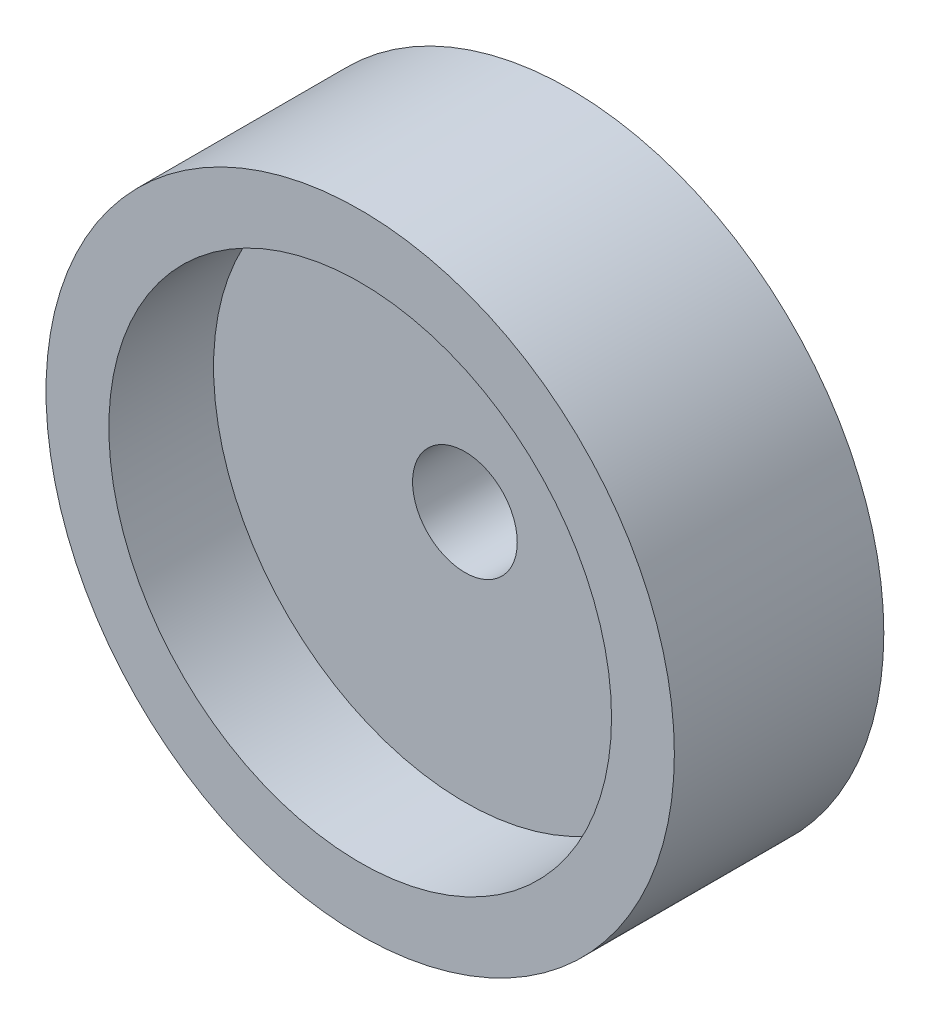
ISO-10303-21;
HEADER;
FILE_DESCRIPTION(('STEP AP214'),'2;1');
FILE_NAME('part.step','',(''),(''),'','','');
FILE_SCHEMA(('AUTOMOTIVE_DESIGN { 1 0 10303 214 1 1 1 1 }'));
ENDSEC;
DATA;
#1=APPLICATION_CONTEXT('core data for automotive mechanical design processes');
#2=APPLICATION_PROTOCOL_DEFINITION('international standard','automotive_design',2000,#1);
#3=PRODUCT_CONTEXT('',#1,'mechanical');
#4=PRODUCT('Part','Part','',(#3));
#5=PRODUCT_RELATED_PRODUCT_CATEGORY('part','',(#4));
#6=PRODUCT_DEFINITION_FORMATION('','',#4);
#7=PRODUCT_DEFINITION_CONTEXT('part definition',#1,'design');
#8=PRODUCT_DEFINITION('design','',#6,#7);
#9=PRODUCT_DEFINITION_SHAPE('','',#8);
#10=(LENGTH_UNIT() NAMED_UNIT(*) SI_UNIT(.MILLI.,.METRE.));
#11=(NAMED_UNIT(*) PLANE_ANGLE_UNIT() SI_UNIT($,.RADIAN.));
#12=(NAMED_UNIT(*) SI_UNIT($,.STERADIAN.) SOLID_ANGLE_UNIT());
#13=UNCERTAINTY_MEASURE_WITH_UNIT(LENGTH_MEASURE(1.E-05),#10,'distance_accuracy_value','');
#14=(GEOMETRIC_REPRESENTATION_CONTEXT(3) GLOBAL_UNCERTAINTY_ASSIGNED_CONTEXT((#13)) GLOBAL_UNIT_ASSIGNED_CONTEXT((#10,
#11,#12)) REPRESENTATION_CONTEXT('',''));
#15=CARTESIAN_POINT('',(0.,0.,0.));
#16=DIRECTION('',(0.,0.,1.));
#17=DIRECTION('',(1.,0.,0.));
#18=AXIS2_PLACEMENT_3D('',#15,#16,#17);
#19=CARTESIAN_POINT('',(0.,0.,3.175));
#20=DIRECTION('',(0.,0.,-1.));
#21=DIRECTION('',(-1.,0.,0.));
#22=AXIS2_PLACEMENT_3D('',#19,#20,#21);
#23=CYLINDRICAL_SURFACE('',#22,1.5875);
#24=CARTESIAN_POINT('',(0.,0.,3.175));
#25=DIRECTION('',(0.,0.,1.));
#26=DIRECTION('',(1.,0.,0.));
#27=AXIS2_PLACEMENT_3D('',#24,#25,#26);
#28=CIRCLE('',#27,1.5875);
#29=CARTESIAN_POINT('',(1.5875,0.,3.175));
#30=VERTEX_POINT('',#29);
#31=EDGE_CURVE('E10',#30,#30,#28,.T.);
#32=ORIENTED_EDGE('',*,*,#31,.T.);
#33=EDGE_LOOP('',(#32));
#34=FACE_BOUND('',#33,.T.);
#35=CARTESIAN_POINT('',(0.,0.,0.));
#36=DIRECTION('',(0.,0.,1.));
#37=DIRECTION('',(1.,0.,0.));
#38=AXIS2_PLACEMENT_3D('',#35,#36,#37);
#39=CIRCLE('',#38,1.5875);
#40=CARTESIAN_POINT('',(1.5875,0.,0.));
#41=VERTEX_POINT('',#40);
#42=EDGE_CURVE('E40',#41,#41,#39,.T.);
#43=ORIENTED_EDGE('',*,*,#42,.F.);
#44=EDGE_LOOP('',(#43));
#45=FACE_BOUND('',#44,.T.);
#46=ADVANCED_FACE('F37',(#34,#45),#23,.F.);
#47=CARTESIAN_POINT('',(0.,0.,3.175));
#48=DIRECTION('',(0.,0.,1.));
#49=DIRECTION('',(1.,0.,0.));
#50=AXIS2_PLACEMENT_3D('',#47,#48,#49);
#51=PLANE('',#50);
#52=ORIENTED_EDGE('',*,*,#31,.F.);
#53=EDGE_LOOP('',(#52));
#54=FACE_BOUND('',#53,.T.);
#55=CARTESIAN_POINT('',(0.,0.,3.175));
#56=DIRECTION('',(0.,0.,1.));
#57=DIRECTION('',(1.,0.,0.));
#58=AXIS2_PLACEMENT_3D('',#55,#56,#57);
#59=CIRCLE('',#58,7.62);
#60=CARTESIAN_POINT('',(7.62,0.,3.175));
#61=VERTEX_POINT('',#60);
#62=EDGE_CURVE('E47',#61,#61,#59,.F.);
#63=ORIENTED_EDGE('',*,*,#62,.F.);
#64=EDGE_LOOP('',(#63));
#65=FACE_BOUND('',#64,.T.);
#66=ADVANCED_FACE('F77',(#54,#65),#51,.T.);
#67=CARTESIAN_POINT('',(0.,0.,0.));
#68=DIRECTION('',(0.,0.,1.));
#69=DIRECTION('',(1.,0.,0.));
#70=AXIS2_PLACEMENT_3D('',#67,#68,#69);
#71=PLANE('',#70);
#72=ORIENTED_EDGE('',*,*,#42,.T.);
#73=EDGE_LOOP('',(#72));
#74=FACE_BOUND('',#73,.T.);
#75=CARTESIAN_POINT('',(0.,0.,0.));
#76=DIRECTION('',(0.,0.,1.));
#77=DIRECTION('',(1.,0.,0.));
#78=AXIS2_PLACEMENT_3D('',#75,#76,#77);
#79=CIRCLE('',#78,9.525);
#80=CARTESIAN_POINT('',(9.525,0.,0.));
#81=VERTEX_POINT('',#80);
#82=EDGE_CURVE('E52',#81,#81,#79,.T.);
#83=ORIENTED_EDGE('',*,*,#82,.F.);
#84=EDGE_LOOP('',(#83));
#85=FACE_BOUND('',#84,.T.);
#86=ADVANCED_FACE('F75',(#74,#85),#71,.F.);
#87=CARTESIAN_POINT('',(0.,0.,6.35));
#88=DIRECTION('',(0.,0.,-1.));
#89=DIRECTION('',(-1.,0.,0.));
#90=AXIS2_PLACEMENT_3D('',#87,#88,#89);
#91=CYLINDRICAL_SURFACE('',#90,7.62);
#92=ORIENTED_EDGE('',*,*,#62,.T.);
#93=EDGE_LOOP('',(#92));
#94=FACE_BOUND('',#93,.T.);
#95=CARTESIAN_POINT('',(0.,0.,6.35));
#96=DIRECTION('',(0.,0.,1.));
#97=DIRECTION('',(1.,0.,0.));
#98=AXIS2_PLACEMENT_3D('',#95,#96,#97);
#99=CIRCLE('',#98,7.62);
#100=CARTESIAN_POINT('',(7.62,0.,6.35));
#101=VERTEX_POINT('',#100);
#102=EDGE_CURVE('E55',#101,#101,#99,.T.);
#103=ORIENTED_EDGE('',*,*,#102,.T.);
#104=EDGE_LOOP('',(#103));
#105=FACE_BOUND('',#104,.T.);
#106=ADVANCED_FACE('F61',(#94,#105),#91,.F.);
#107=CARTESIAN_POINT('',(0.,0.,6.35));
#108=DIRECTION('',(0.,0.,-1.));
#109=DIRECTION('',(-1.,0.,0.));
#110=AXIS2_PLACEMENT_3D('',#107,#108,#109);
#111=CYLINDRICAL_SURFACE('',#110,9.525);
#112=CARTESIAN_POINT('',(0.,0.,6.35));
#113=DIRECTION('',(0.,0.,1.));
#114=DIRECTION('',(1.,0.,0.));
#115=AXIS2_PLACEMENT_3D('',#112,#113,#114);
#116=CIRCLE('',#115,9.525);
#117=CARTESIAN_POINT('',(9.525,0.,6.35));
#118=VERTEX_POINT('',#117);
#119=EDGE_CURVE('E51',#118,#118,#116,.T.);
#120=ORIENTED_EDGE('',*,*,#119,.F.);
#121=EDGE_LOOP('',(#120));
#122=FACE_BOUND('',#121,.T.);
#123=ORIENTED_EDGE('',*,*,#82,.T.);
#124=EDGE_LOOP('',(#123));
#125=FACE_BOUND('',#124,.T.);
#126=ADVANCED_FACE('F66',(#122,#125),#111,.T.);
#127=CARTESIAN_POINT('',(0.,0.,6.35));
#128=DIRECTION('',(0.,0.,1.));
#129=DIRECTION('',(1.,0.,0.));
#130=AXIS2_PLACEMENT_3D('',#127,#128,#129);
#131=PLANE('',#130);
#132=ORIENTED_EDGE('',*,*,#102,.F.);
#133=EDGE_LOOP('',(#132));
#134=FACE_BOUND('',#133,.T.);
#135=ORIENTED_EDGE('',*,*,#119,.T.);
#136=EDGE_LOOP('',(#135));
#137=FACE_BOUND('',#136,.T.);
#138=ADVANCED_FACE('F63',(#134,#137),#131,.T.);
#139=CLOSED_SHELL('',(#46,#66,#86,#106,#126,#138));
#140=MANIFOLD_SOLID_BREP('B2',#139);
#141=ADVANCED_BREP_SHAPE_REPRESENTATION('',(#18,#140),#14);
#142=SHAPE_DEFINITION_REPRESENTATION(#9,#141);
ENDSEC;
END-ISO-10303-21;
